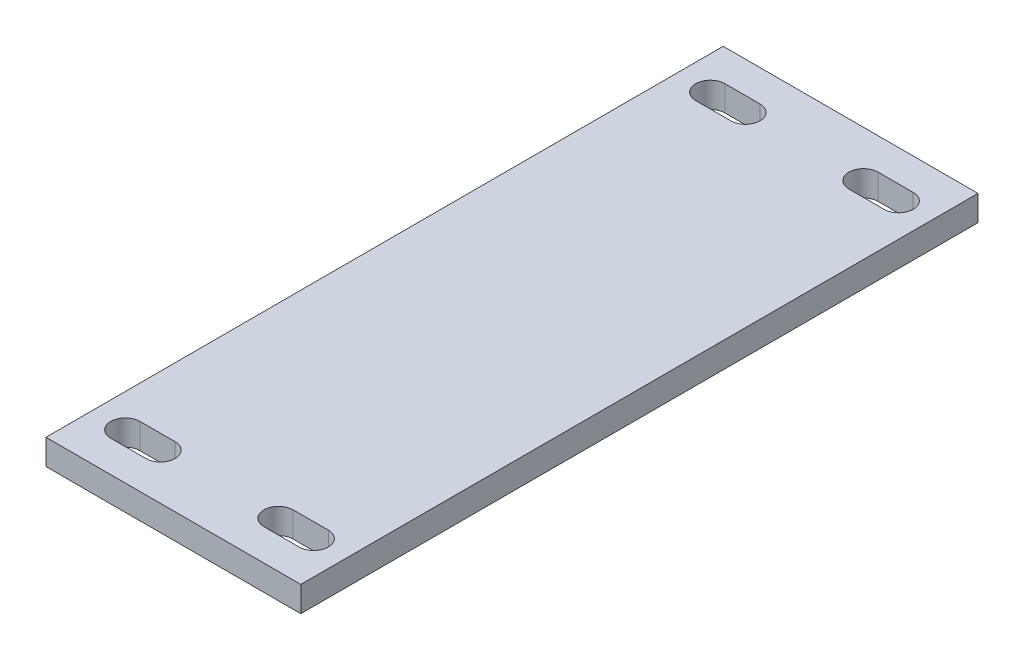
ISO-10303-21;
HEADER;
FILE_DESCRIPTION(('STEP AP214'),'2;1');
FILE_NAME('part.step','',(''),(''),'','','');
FILE_SCHEMA(('AUTOMOTIVE_DESIGN { 1 0 10303 214 1 1 1 1 }'));
ENDSEC;
DATA;
#1=APPLICATION_CONTEXT('core data for automotive mechanical design processes');
#2=APPLICATION_PROTOCOL_DEFINITION('international standard','automotive_design',2000,#1);
#3=PRODUCT_CONTEXT('',#1,'mechanical');
#4=PRODUCT('Part','Part','',(#3));
#5=PRODUCT_RELATED_PRODUCT_CATEGORY('part','',(#4));
#6=PRODUCT_DEFINITION_FORMATION('','',#4);
#7=PRODUCT_DEFINITION_CONTEXT('part definition',#1,'design');
#8=PRODUCT_DEFINITION('design','',#6,#7);
#9=PRODUCT_DEFINITION_SHAPE('','',#8);
#10=(LENGTH_UNIT() NAMED_UNIT(*) SI_UNIT(.MILLI.,.METRE.));
#11=(NAMED_UNIT(*) PLANE_ANGLE_UNIT() SI_UNIT($,.RADIAN.));
#12=(NAMED_UNIT(*) SI_UNIT($,.STERADIAN.) SOLID_ANGLE_UNIT());
#13=UNCERTAINTY_MEASURE_WITH_UNIT(LENGTH_MEASURE(1.E-05),#10,'distance_accuracy_value','');
#14=(GEOMETRIC_REPRESENTATION_CONTEXT(3) GLOBAL_UNCERTAINTY_ASSIGNED_CONTEXT((#13)) GLOBAL_UNIT_ASSIGNED_CONTEXT((#10,
#11,#12)) REPRESENTATION_CONTEXT('',''));
#15=CARTESIAN_POINT('',(0.,0.,0.));
#16=DIRECTION('',(0.,0.,1.));
#17=DIRECTION('',(1.,0.,0.));
#18=AXIS2_PLACEMENT_3D('',#15,#16,#17);
#19=CARTESIAN_POINT('',(0.,6.,0.));
#20=DIRECTION('',(0.,-1.,0.));
#21=DIRECTION('',(0.,0.,-1.));
#22=AXIS2_PLACEMENT_3D('',#19,#20,#21);
#23=PLANE('',#22);
#24=CARTESIAN_POINT('',(52.35,6.,-10.9));
#25=DIRECTION('',(0.,1.,0.));
#26=DIRECTION('',(0.,0.,1.));
#27=AXIS2_PLACEMENT_3D('',#24,#25,#26);
#28=CIRCLE('',#27,3.44999999999999);
#29=CARTESIAN_POINT('',(52.35,6.,-7.45000000000001));
#30=VERTEX_POINT('',#29);
#31=CARTESIAN_POINT('',(52.35,6.,-14.35));
#32=VERTEX_POINT('',#31);
#33=EDGE_CURVE('E210',#30,#32,#28,.T.);
#34=ORIENTED_EDGE('',*,*,#33,.F.);
#35=DIRECTION('',(1.,0.,0.));
#36=VECTOR('',#35,1.);
#37=CARTESIAN_POINT('',(52.35,6.,-7.45000000000001));
#38=LINE('',#37,#36);
#39=CARTESIAN_POINT('',(44.05,6.,-7.45000000000001));
#40=VERTEX_POINT('',#39);
#41=EDGE_CURVE('E218',#40,#30,#38,.T.);
#42=ORIENTED_EDGE('',*,*,#41,.F.);
#43=CARTESIAN_POINT('',(44.05,6.,-10.9));
#44=DIRECTION('',(0.,1.,0.));
#45=DIRECTION('',(0.,0.,1.));
#46=AXIS2_PLACEMENT_3D('',#43,#44,#45);
#47=CIRCLE('',#46,3.44999999999999);
#48=CARTESIAN_POINT('',(44.05,6.,-14.35));
#49=VERTEX_POINT('',#48);
#50=EDGE_CURVE('E215',#49,#40,#47,.T.);
#51=ORIENTED_EDGE('',*,*,#50,.F.);
#52=DIRECTION('',(-1.,0.,0.));
#53=VECTOR('',#52,1.);
#54=CARTESIAN_POINT('',(52.35,6.,-14.35));
#55=LINE('',#54,#53);
#56=EDGE_CURVE('E212',#32,#49,#55,.T.);
#57=ORIENTED_EDGE('',*,*,#56,.F.);
#58=EDGE_LOOP('',(#34,#42,#51,#57));
#59=FACE_BOUND('',#58,.T.);
#60=CARTESIAN_POINT('',(7.85,6.,-149.1));
#61=DIRECTION('',(0.,1.,0.));
#62=DIRECTION('',(0.,0.,1.));
#63=AXIS2_PLACEMENT_3D('',#60,#61,#62);
#64=CIRCLE('',#63,3.44999999999999);
#65=CARTESIAN_POINT('',(7.85,6.,-152.55));
#66=VERTEX_POINT('',#65);
#67=CARTESIAN_POINT('',(7.85,6.,-145.65));
#68=VERTEX_POINT('',#67);
#69=EDGE_CURVE('E272',#66,#68,#64,.T.);
#70=ORIENTED_EDGE('',*,*,#69,.F.);
#71=DIRECTION('',(-1.,0.,0.));
#72=VECTOR('',#71,1.);
#73=CARTESIAN_POINT('',(7.85,6.,-152.55));
#74=LINE('',#73,#72);
#75=CARTESIAN_POINT('',(16.15,6.,-152.55));
#76=VERTEX_POINT('',#75);
#77=EDGE_CURVE('E280',#76,#66,#74,.T.);
#78=ORIENTED_EDGE('',*,*,#77,.F.);
#79=CARTESIAN_POINT('',(16.15,6.,-149.1));
#80=DIRECTION('',(0.,1.,0.));
#81=DIRECTION('',(0.,0.,1.));
#82=AXIS2_PLACEMENT_3D('',#79,#80,#81);
#83=CIRCLE('',#82,3.44999999999999);
#84=CARTESIAN_POINT('',(16.15,6.,-145.65));
#85=VERTEX_POINT('',#84);
#86=EDGE_CURVE('E277',#85,#76,#83,.T.);
#87=ORIENTED_EDGE('',*,*,#86,.F.);
#88=DIRECTION('',(1.,0.,0.));
#89=VECTOR('',#88,1.);
#90=CARTESIAN_POINT('',(7.85,6.,-145.65));
#91=LINE('',#90,#89);
#92=EDGE_CURVE('E274',#68,#85,#91,.T.);
#93=ORIENTED_EDGE('',*,*,#92,.F.);
#94=EDGE_LOOP('',(#70,#78,#87,#93));
#95=FACE_BOUND('',#94,.T.);
#96=DIRECTION('',(0.,0.,1.));
#97=VECTOR('',#96,1.);
#98=CARTESIAN_POINT('',(0.,6.,0.));
#99=LINE('',#98,#97);
#100=CARTESIAN_POINT('',(0.,6.,-160.));
#101=VERTEX_POINT('',#100);
#102=CARTESIAN_POINT('',(0.,6.,0.));
#103=VERTEX_POINT('',#102);
#104=EDGE_CURVE('E303',#101,#103,#99,.T.);
#105=ORIENTED_EDGE('',*,*,#104,.T.);
#106=DIRECTION('',(1.,0.,0.));
#107=VECTOR('',#106,1.);
#108=CARTESIAN_POINT('',(0.,6.,0.));
#109=LINE('',#108,#107);
#110=CARTESIAN_POINT('',(60.2,6.,0.));
#111=VERTEX_POINT('',#110);
#112=EDGE_CURVE('E306',#103,#111,#109,.T.);
#113=ORIENTED_EDGE('',*,*,#112,.T.);
#114=DIRECTION('',(0.,0.,-1.));
#115=VECTOR('',#114,1.);
#116=CARTESIAN_POINT('',(60.2,6.,0.));
#117=LINE('',#116,#115);
#118=CARTESIAN_POINT('',(60.2,6.,-160.));
#119=VERTEX_POINT('',#118);
#120=EDGE_CURVE('E309',#111,#119,#117,.T.);
#121=ORIENTED_EDGE('',*,*,#120,.T.);
#122=DIRECTION('',(-1.,0.,0.));
#123=VECTOR('',#122,1.);
#124=CARTESIAN_POINT('',(0.,6.,-160.));
#125=LINE('',#124,#123);
#126=EDGE_CURVE('E311',#119,#101,#125,.T.);
#127=ORIENTED_EDGE('',*,*,#126,.T.);
#128=EDGE_LOOP('',(#105,#113,#121,#127));
#129=FACE_BOUND('',#128,.T.);
#130=CARTESIAN_POINT('',(52.35,6.,-149.1));
#131=DIRECTION('',(0.,1.,0.));
#132=DIRECTION('',(0.,0.,-1.));
#133=AXIS2_PLACEMENT_3D('',#130,#131,#132);
#134=CIRCLE('',#133,3.44999999999999);
#135=CARTESIAN_POINT('',(52.35,6.,-145.65));
#136=VERTEX_POINT('',#135);
#137=CARTESIAN_POINT('',(52.35,6.,-152.55));
#138=VERTEX_POINT('',#137);
#139=EDGE_CURVE('E241',#136,#138,#134,.T.);
#140=ORIENTED_EDGE('',*,*,#139,.F.);
#141=DIRECTION('',(1.,0.,0.));
#142=VECTOR('',#141,1.);
#143=CARTESIAN_POINT('',(52.35,6.,-145.65));
#144=LINE('',#143,#142);
#145=CARTESIAN_POINT('',(44.05,6.,-145.65));
#146=VERTEX_POINT('',#145);
#147=EDGE_CURVE('E249',#146,#136,#144,.T.);
#148=ORIENTED_EDGE('',*,*,#147,.F.);
#149=CARTESIAN_POINT('',(44.05,6.,-149.1));
#150=DIRECTION('',(0.,1.,0.));
#151=DIRECTION('',(0.,0.,-1.));
#152=AXIS2_PLACEMENT_3D('',#149,#150,#151);
#153=CIRCLE('',#152,3.44999999999999);
#154=CARTESIAN_POINT('',(44.05,6.,-152.55));
#155=VERTEX_POINT('',#154);
#156=EDGE_CURVE('E246',#155,#146,#153,.T.);
#157=ORIENTED_EDGE('',*,*,#156,.F.);
#158=DIRECTION('',(-1.,0.,0.));
#159=VECTOR('',#158,1.);
#160=CARTESIAN_POINT('',(52.35,6.,-152.55));
#161=LINE('',#160,#159);
#162=EDGE_CURVE('E243',#138,#155,#161,.T.);
#163=ORIENTED_EDGE('',*,*,#162,.F.);
#164=EDGE_LOOP('',(#140,#148,#157,#163));
#165=FACE_BOUND('',#164,.T.);
#166=CARTESIAN_POINT('',(7.85,6.,-10.9));
#167=DIRECTION('',(0.,1.,0.));
#168=DIRECTION('',(0.,0.,-1.));
#169=AXIS2_PLACEMENT_3D('',#166,#167,#168);
#170=CIRCLE('',#169,3.44999999999999);
#171=CARTESIAN_POINT('',(7.85,6.,-14.35));
#172=VERTEX_POINT('',#171);
#173=CARTESIAN_POINT('',(7.85,6.,-7.45000000000001));
#174=VERTEX_POINT('',#173);
#175=EDGE_CURVE('E174',#172,#174,#170,.T.);
#176=ORIENTED_EDGE('',*,*,#175,.F.);
#177=DIRECTION('',(-1.,0.,0.));
#178=VECTOR('',#177,1.);
#179=CARTESIAN_POINT('',(7.85,6.,-14.35));
#180=LINE('',#179,#178);
#181=CARTESIAN_POINT('',(16.15,6.,-14.35));
#182=VERTEX_POINT('',#181);
#183=EDGE_CURVE('E196',#182,#172,#180,.T.);
#184=ORIENTED_EDGE('',*,*,#183,.F.);
#185=CARTESIAN_POINT('',(16.15,6.,-10.9));
#186=DIRECTION('',(0.,1.,0.));
#187=DIRECTION('',(0.,0.,-1.));
#188=AXIS2_PLACEMENT_3D('',#185,#186,#187);
#189=CIRCLE('',#188,3.44999999999999);
#190=CARTESIAN_POINT('',(16.15,6.,-7.45000000000001));
#191=VERTEX_POINT('',#190);
#192=EDGE_CURVE('E194',#191,#182,#189,.T.);
#193=ORIENTED_EDGE('',*,*,#192,.F.);
#194=DIRECTION('',(1.,0.,0.));
#195=VECTOR('',#194,1.);
#196=CARTESIAN_POINT('',(7.85,6.,-7.45000000000001));
#197=LINE('',#196,#195);
#198=EDGE_CURVE('E182',#174,#191,#197,.T.);
#199=ORIENTED_EDGE('',*,*,#198,.F.);
#200=EDGE_LOOP('',(#176,#184,#193,#199));
#201=FACE_BOUND('',#200,.T.);
#202=ADVANCED_FACE('F37',(#59,#95,#129,#165,#201),#23,.F.);
#203=CARTESIAN_POINT('',(0.,0.,0.));
#204=DIRECTION('',(0.,-1.,0.));
#205=DIRECTION('',(0.,0.,-1.));
#206=AXIS2_PLACEMENT_3D('',#203,#204,#205);
#207=PLANE('',#206);
#208=DIRECTION('',(0.,0.,1.));
#209=VECTOR('',#208,1.);
#210=CARTESIAN_POINT('',(0.,0.,0.));
#211=LINE('',#210,#209);
#212=CARTESIAN_POINT('',(0.,0.,-160.));
#213=VERTEX_POINT('',#212);
#214=CARTESIAN_POINT('',(0.,0.,0.));
#215=VERTEX_POINT('',#214);
#216=EDGE_CURVE('E302',#213,#215,#211,.T.);
#217=ORIENTED_EDGE('',*,*,#216,.F.);
#218=DIRECTION('',(-1.,0.,0.));
#219=VECTOR('',#218,1.);
#220=CARTESIAN_POINT('',(0.,0.,-160.));
#221=LINE('',#220,#219);
#222=CARTESIAN_POINT('',(60.2,0.,-160.));
#223=VERTEX_POINT('',#222);
#224=EDGE_CURVE('E307',#223,#213,#221,.T.);
#225=ORIENTED_EDGE('',*,*,#224,.F.);
#226=DIRECTION('',(0.,0.,-1.));
#227=VECTOR('',#226,1.);
#228=CARTESIAN_POINT('',(60.2,0.,0.));
#229=LINE('',#228,#227);
#230=CARTESIAN_POINT('',(60.2,0.,0.));
#231=VERTEX_POINT('',#230);
#232=EDGE_CURVE('E318',#231,#223,#229,.T.);
#233=ORIENTED_EDGE('',*,*,#232,.F.);
#234=DIRECTION('',(1.,0.,0.));
#235=VECTOR('',#234,1.);
#236=CARTESIAN_POINT('',(0.,0.,0.));
#237=LINE('',#236,#235);
#238=EDGE_CURVE('E316',#215,#231,#237,.T.);
#239=ORIENTED_EDGE('',*,*,#238,.F.);
#240=EDGE_LOOP('',(#217,#225,#233,#239));
#241=FACE_BOUND('',#240,.T.);
#242=DIRECTION('',(-1.,0.,0.));
#243=VECTOR('',#242,1.);
#244=CARTESIAN_POINT('',(7.85,0.,-152.55));
#245=LINE('',#244,#243);
#246=CARTESIAN_POINT('',(16.15,0.,-152.55));
#247=VERTEX_POINT('',#246);
#248=CARTESIAN_POINT('',(7.85,0.,-152.55));
#249=VERTEX_POINT('',#248);
#250=EDGE_CURVE('E275',#247,#249,#245,.T.);
#251=ORIENTED_EDGE('',*,*,#250,.T.);
#252=CARTESIAN_POINT('',(7.85,0.,-149.1));
#253=DIRECTION('',(0.,1.,0.));
#254=DIRECTION('',(0.,0.,1.));
#255=AXIS2_PLACEMENT_3D('',#252,#253,#254);
#256=CIRCLE('',#255,3.44999999999999);
#257=CARTESIAN_POINT('',(7.85,0.,-145.65));
#258=VERTEX_POINT('',#257);
#259=EDGE_CURVE('E271',#249,#258,#256,.T.);
#260=ORIENTED_EDGE('',*,*,#259,.T.);
#261=DIRECTION('',(1.,0.,0.));
#262=VECTOR('',#261,1.);
#263=CARTESIAN_POINT('',(7.85,0.,-145.65));
#264=LINE('',#263,#262);
#265=CARTESIAN_POINT('',(16.15,0.,-145.65));
#266=VERTEX_POINT('',#265);
#267=EDGE_CURVE('E285',#258,#266,#264,.T.);
#268=ORIENTED_EDGE('',*,*,#267,.T.);
#269=CARTESIAN_POINT('',(16.15,0.,-149.1));
#270=DIRECTION('',(0.,1.,0.));
#271=DIRECTION('',(0.,0.,1.));
#272=AXIS2_PLACEMENT_3D('',#269,#270,#271);
#273=CIRCLE('',#272,3.44999999999999);
#274=EDGE_CURVE('E288',#266,#247,#273,.T.);
#275=ORIENTED_EDGE('',*,*,#274,.T.);
#276=EDGE_LOOP('',(#251,#260,#268,#275));
#277=FACE_BOUND('',#276,.T.);
#278=DIRECTION('',(1.,0.,0.));
#279=VECTOR('',#278,1.);
#280=CARTESIAN_POINT('',(52.35,0.,-145.65));
#281=LINE('',#280,#279);
#282=CARTESIAN_POINT('',(44.05,0.,-145.65));
#283=VERTEX_POINT('',#282);
#284=CARTESIAN_POINT('',(52.35,0.,-145.65));
#285=VERTEX_POINT('',#284);
#286=EDGE_CURVE('E244',#283,#285,#281,.T.);
#287=ORIENTED_EDGE('',*,*,#286,.T.);
#288=CARTESIAN_POINT('',(52.35,0.,-149.1));
#289=DIRECTION('',(0.,1.,0.));
#290=DIRECTION('',(0.,0.,-1.));
#291=AXIS2_PLACEMENT_3D('',#288,#289,#290);
#292=CIRCLE('',#291,3.44999999999999);
#293=CARTESIAN_POINT('',(52.35,0.,-152.55));
#294=VERTEX_POINT('',#293);
#295=EDGE_CURVE('E240',#285,#294,#292,.T.);
#296=ORIENTED_EDGE('',*,*,#295,.T.);
#297=DIRECTION('',(-1.,0.,0.));
#298=VECTOR('',#297,1.);
#299=CARTESIAN_POINT('',(52.35,0.,-152.55));
#300=LINE('',#299,#298);
#301=CARTESIAN_POINT('',(44.05,0.,-152.55));
#302=VERTEX_POINT('',#301);
#303=EDGE_CURVE('E254',#294,#302,#300,.T.);
#304=ORIENTED_EDGE('',*,*,#303,.T.);
#305=CARTESIAN_POINT('',(44.05,0.,-149.1));
#306=DIRECTION('',(0.,1.,0.));
#307=DIRECTION('',(0.,0.,-1.));
#308=AXIS2_PLACEMENT_3D('',#305,#306,#307);
#309=CIRCLE('',#308,3.44999999999999);
#310=EDGE_CURVE('E257',#302,#283,#309,.T.);
#311=ORIENTED_EDGE('',*,*,#310,.T.);
#312=EDGE_LOOP('',(#287,#296,#304,#311));
#313=FACE_BOUND('',#312,.T.);
#314=DIRECTION('',(1.,0.,0.));
#315=VECTOR('',#314,1.);
#316=CARTESIAN_POINT('',(52.35,0.,-7.45000000000001));
#317=LINE('',#316,#315);
#318=CARTESIAN_POINT('',(44.05,0.,-7.45000000000001));
#319=VERTEX_POINT('',#318);
#320=CARTESIAN_POINT('',(52.35,0.,-7.45000000000001));
#321=VERTEX_POINT('',#320);
#322=EDGE_CURVE('E213',#319,#321,#317,.T.);
#323=ORIENTED_EDGE('',*,*,#322,.T.);
#324=CARTESIAN_POINT('',(52.35,0.,-10.9));
#325=DIRECTION('',(0.,1.,0.));
#326=DIRECTION('',(0.,0.,1.));
#327=AXIS2_PLACEMENT_3D('',#324,#325,#326);
#328=CIRCLE('',#327,3.44999999999999);
#329=CARTESIAN_POINT('',(52.35,0.,-14.35));
#330=VERTEX_POINT('',#329);
#331=EDGE_CURVE('E190',#321,#330,#328,.T.);
#332=ORIENTED_EDGE('',*,*,#331,.T.);
#333=DIRECTION('',(-1.,0.,0.));
#334=VECTOR('',#333,1.);
#335=CARTESIAN_POINT('',(52.35,0.,-14.35));
#336=LINE('',#335,#334);
#337=CARTESIAN_POINT('',(44.05,0.,-14.35));
#338=VERTEX_POINT('',#337);
#339=EDGE_CURVE('E223',#330,#338,#336,.T.);
#340=ORIENTED_EDGE('',*,*,#339,.T.);
#341=CARTESIAN_POINT('',(44.05,0.,-10.9));
#342=DIRECTION('',(0.,1.,0.));
#343=DIRECTION('',(0.,0.,1.));
#344=AXIS2_PLACEMENT_3D('',#341,#342,#343);
#345=CIRCLE('',#344,3.44999999999999);
#346=EDGE_CURVE('E226',#338,#319,#345,.T.);
#347=ORIENTED_EDGE('',*,*,#346,.T.);
#348=EDGE_LOOP('',(#323,#332,#340,#347));
#349=FACE_BOUND('',#348,.T.);
#350=DIRECTION('',(-1.,0.,0.));
#351=VECTOR('',#350,1.);
#352=CARTESIAN_POINT('',(7.85,0.,-14.35));
#353=LINE('',#352,#351);
#354=CARTESIAN_POINT('',(16.15,0.,-14.35));
#355=VERTEX_POINT('',#354);
#356=CARTESIAN_POINT('',(7.85,0.,-14.35));
#357=VERTEX_POINT('',#356);
#358=EDGE_CURVE('E183',#355,#357,#353,.T.);
#359=ORIENTED_EDGE('',*,*,#358,.T.);
#360=CARTESIAN_POINT('',(7.85,0.,-10.9));
#361=DIRECTION('',(0.,1.,0.));
#362=DIRECTION('',(0.,0.,-1.));
#363=AXIS2_PLACEMENT_3D('',#360,#361,#362);
#364=CIRCLE('',#363,3.44999999999999);
#365=CARTESIAN_POINT('',(7.85,0.,-7.45000000000001));
#366=VERTEX_POINT('',#365);
#367=EDGE_CURVE('E60',#357,#366,#364,.T.);
#368=ORIENTED_EDGE('',*,*,#367,.T.);
#369=DIRECTION('',(1.,0.,0.));
#370=VECTOR('',#369,1.);
#371=CARTESIAN_POINT('',(7.85,0.,-7.45000000000001));
#372=LINE('',#371,#370);
#373=CARTESIAN_POINT('',(16.15,0.,-7.45000000000001));
#374=VERTEX_POINT('',#373);
#375=EDGE_CURVE('E189',#366,#374,#372,.T.);
#376=ORIENTED_EDGE('',*,*,#375,.T.);
#377=CARTESIAN_POINT('',(16.15,0.,-10.9));
#378=DIRECTION('',(0.,1.,0.));
#379=DIRECTION('',(0.,0.,-1.));
#380=AXIS2_PLACEMENT_3D('',#377,#378,#379);
#381=CIRCLE('',#380,3.44999999999999);
#382=EDGE_CURVE('E202',#374,#355,#381,.T.);
#383=ORIENTED_EDGE('',*,*,#382,.T.);
#384=EDGE_LOOP('',(#359,#368,#376,#383));
#385=FACE_BOUND('',#384,.T.);
#386=ADVANCED_FACE('F336',(#241,#277,#313,#349,#385),#207,.T.);
#387=CARTESIAN_POINT('',(0.,6.,0.));
#388=DIRECTION('',(1.,0.,0.));
#389=DIRECTION('',(0.,0.,-1.));
#390=AXIS2_PLACEMENT_3D('',#387,#388,#389);
#391=PLANE('',#390);
#392=ORIENTED_EDGE('',*,*,#216,.T.);
#393=DIRECTION('',(0.,-1.,0.));
#394=VECTOR('',#393,1.);
#395=CARTESIAN_POINT('',(0.,6.,0.));
#396=LINE('',#395,#394);
#397=EDGE_CURVE('E11',#103,#215,#396,.T.);
#398=ORIENTED_EDGE('',*,*,#397,.F.);
#399=ORIENTED_EDGE('',*,*,#104,.F.);
#400=DIRECTION('',(0.,-1.,0.));
#401=VECTOR('',#400,1.);
#402=CARTESIAN_POINT('',(0.,6.,-160.));
#403=LINE('',#402,#401);
#404=EDGE_CURVE('E313',#101,#213,#403,.T.);
#405=ORIENTED_EDGE('',*,*,#404,.T.);
#406=EDGE_LOOP('',(#392,#398,#399,#405));
#407=FACE_BOUND('',#406,.T.);
#408=ADVANCED_FACE('F39',(#407),#391,.F.);
#409=CARTESIAN_POINT('',(0.,6.,0.));
#410=DIRECTION('',(0.,0.,-1.));
#411=DIRECTION('',(-1.,0.,0.));
#412=AXIS2_PLACEMENT_3D('',#409,#410,#411);
#413=PLANE('',#412);
#414=ORIENTED_EDGE('',*,*,#238,.T.);
#415=DIRECTION('',(0.,-1.,0.));
#416=VECTOR('',#415,1.);
#417=CARTESIAN_POINT('',(60.2,6.,0.));
#418=LINE('',#417,#416);
#419=EDGE_CURVE('E45',#111,#231,#418,.T.);
#420=ORIENTED_EDGE('',*,*,#419,.F.);
#421=ORIENTED_EDGE('',*,*,#112,.F.);
#422=ORIENTED_EDGE('',*,*,#397,.T.);
#423=EDGE_LOOP('',(#414,#420,#421,#422));
#424=FACE_BOUND('',#423,.T.);
#425=ADVANCED_FACE('F347',(#424),#413,.F.);
#426=CARTESIAN_POINT('',(60.2,6.,0.));
#427=DIRECTION('',(-1.,0.,0.));
#428=DIRECTION('',(0.,0.,1.));
#429=AXIS2_PLACEMENT_3D('',#426,#427,#428);
#430=PLANE('',#429);
#431=ORIENTED_EDGE('',*,*,#232,.T.);
#432=DIRECTION('',(0.,-1.,0.));
#433=VECTOR('',#432,1.);
#434=CARTESIAN_POINT('',(60.2,6.,-160.));
#435=LINE('',#434,#433);
#436=EDGE_CURVE('E323',#119,#223,#435,.T.);
#437=ORIENTED_EDGE('',*,*,#436,.F.);
#438=ORIENTED_EDGE('',*,*,#120,.F.);
#439=ORIENTED_EDGE('',*,*,#419,.T.);
#440=EDGE_LOOP('',(#431,#437,#438,#439));
#441=FACE_BOUND('',#440,.T.);
#442=ADVANCED_FACE('F330',(#441),#430,.F.);
#443=CARTESIAN_POINT('',(0.,6.,-160.));
#444=DIRECTION('',(0.,0.,1.));
#445=DIRECTION('',(1.,0.,0.));
#446=AXIS2_PLACEMENT_3D('',#443,#444,#445);
#447=PLANE('',#446);
#448=ORIENTED_EDGE('',*,*,#224,.T.);
#449=ORIENTED_EDGE('',*,*,#404,.F.);
#450=ORIENTED_EDGE('',*,*,#126,.F.);
#451=ORIENTED_EDGE('',*,*,#436,.T.);
#452=EDGE_LOOP('',(#448,#449,#450,#451));
#453=FACE_BOUND('',#452,.T.);
#454=ADVANCED_FACE('F340',(#453),#447,.F.);
#455=CARTESIAN_POINT('',(7.85,6.,-149.1));
#456=DIRECTION('',(0.,-1.,0.));
#457=DIRECTION('',(0.,0.,-1.));
#458=AXIS2_PLACEMENT_3D('',#455,#456,#457);
#459=CYLINDRICAL_SURFACE('',#458,3.44999999999999);
#460=ORIENTED_EDGE('',*,*,#259,.F.);
#461=DIRECTION('',(0.,-1.,0.));
#462=VECTOR('',#461,1.);
#463=CARTESIAN_POINT('',(7.85,6.,-152.55));
#464=LINE('',#463,#462);
#465=EDGE_CURVE('E282',#66,#249,#464,.T.);
#466=ORIENTED_EDGE('',*,*,#465,.F.);
#467=ORIENTED_EDGE('',*,*,#69,.T.);
#468=DIRECTION('',(0.,-1.,0.));
#469=VECTOR('',#468,1.);
#470=CARTESIAN_POINT('',(7.85,6.,-145.65));
#471=LINE('',#470,#469);
#472=EDGE_CURVE('E299',#68,#258,#471,.T.);
#473=ORIENTED_EDGE('',*,*,#472,.T.);
#474=EDGE_LOOP('',(#460,#466,#467,#473));
#475=FACE_BOUND('',#474,.T.);
#476=ADVANCED_FACE('F364',(#475),#459,.F.);
#477=CARTESIAN_POINT('',(7.85,6.,-145.65));
#478=DIRECTION('',(0.,0.,-1.));
#479=DIRECTION('',(-1.,0.,0.));
#480=AXIS2_PLACEMENT_3D('',#477,#478,#479);
#481=PLANE('',#480);
#482=ORIENTED_EDGE('',*,*,#267,.F.);
#483=ORIENTED_EDGE('',*,*,#472,.F.);
#484=ORIENTED_EDGE('',*,*,#92,.T.);
#485=DIRECTION('',(0.,-1.,0.));
#486=VECTOR('',#485,1.);
#487=CARTESIAN_POINT('',(16.15,6.,-145.65));
#488=LINE('',#487,#486);
#489=EDGE_CURVE('E297',#85,#266,#488,.T.);
#490=ORIENTED_EDGE('',*,*,#489,.T.);
#491=EDGE_LOOP('',(#482,#483,#484,#490));
#492=FACE_BOUND('',#491,.T.);
#493=ADVANCED_FACE('F371',(#492),#481,.T.);
#494=CARTESIAN_POINT('',(16.15,6.,-149.1));
#495=DIRECTION('',(0.,-1.,0.));
#496=DIRECTION('',(0.,0.,-1.));
#497=AXIS2_PLACEMENT_3D('',#494,#495,#496);
#498=CYLINDRICAL_SURFACE('',#497,3.44999999999999);
#499=ORIENTED_EDGE('',*,*,#274,.F.);
#500=ORIENTED_EDGE('',*,*,#489,.F.);
#501=ORIENTED_EDGE('',*,*,#86,.T.);
#502=DIRECTION('',(0.,-1.,0.));
#503=VECTOR('',#502,1.);
#504=CARTESIAN_POINT('',(16.15,6.,-152.55));
#505=LINE('',#504,#503);
#506=EDGE_CURVE('E295',#76,#247,#505,.T.);
#507=ORIENTED_EDGE('',*,*,#506,.T.);
#508=EDGE_LOOP('',(#499,#500,#501,#507));
#509=FACE_BOUND('',#508,.T.);
#510=ADVANCED_FACE('F376',(#509),#498,.F.);
#511=CARTESIAN_POINT('',(7.85,6.,-152.55));
#512=DIRECTION('',(0.,0.,1.));
#513=DIRECTION('',(1.,0.,0.));
#514=AXIS2_PLACEMENT_3D('',#511,#512,#513);
#515=PLANE('',#514);
#516=ORIENTED_EDGE('',*,*,#250,.F.);
#517=ORIENTED_EDGE('',*,*,#506,.F.);
#518=ORIENTED_EDGE('',*,*,#77,.T.);
#519=ORIENTED_EDGE('',*,*,#465,.T.);
#520=EDGE_LOOP('',(#516,#517,#518,#519));
#521=FACE_BOUND('',#520,.T.);
#522=ADVANCED_FACE('F383',(#521),#515,.T.);
#523=CARTESIAN_POINT('',(52.35,6.,-149.1));
#524=DIRECTION('',(0.,-1.,0.));
#525=DIRECTION('',(0.,0.,-1.));
#526=AXIS2_PLACEMENT_3D('',#523,#524,#525);
#527=CYLINDRICAL_SURFACE('',#526,3.44999999999999);
#528=ORIENTED_EDGE('',*,*,#295,.F.);
#529=DIRECTION('',(0.,-1.,0.));
#530=VECTOR('',#529,1.);
#531=CARTESIAN_POINT('',(52.35,6.,-145.65));
#532=LINE('',#531,#530);
#533=EDGE_CURVE('E251',#136,#285,#532,.T.);
#534=ORIENTED_EDGE('',*,*,#533,.F.);
#535=ORIENTED_EDGE('',*,*,#139,.T.);
#536=DIRECTION('',(0.,-1.,0.));
#537=VECTOR('',#536,1.);
#538=CARTESIAN_POINT('',(52.35,6.,-152.55));
#539=LINE('',#538,#537);
#540=EDGE_CURVE('E268',#138,#294,#539,.T.);
#541=ORIENTED_EDGE('',*,*,#540,.T.);
#542=EDGE_LOOP('',(#528,#534,#535,#541));
#543=FACE_BOUND('',#542,.T.);
#544=ADVANCED_FACE('F396',(#543),#527,.F.);
#545=CARTESIAN_POINT('',(52.35,6.,-152.55));
#546=DIRECTION('',(0.,0.,1.));
#547=DIRECTION('',(1.,0.,0.));
#548=AXIS2_PLACEMENT_3D('',#545,#546,#547);
#549=PLANE('',#548);
#550=ORIENTED_EDGE('',*,*,#303,.F.);
#551=ORIENTED_EDGE('',*,*,#540,.F.);
#552=ORIENTED_EDGE('',*,*,#162,.T.);
#553=DIRECTION('',(0.,-1.,0.));
#554=VECTOR('',#553,1.);
#555=CARTESIAN_POINT('',(44.05,6.,-152.55));
#556=LINE('',#555,#554);
#557=EDGE_CURVE('E266',#155,#302,#556,.T.);
#558=ORIENTED_EDGE('',*,*,#557,.T.);
#559=EDGE_LOOP('',(#550,#551,#552,#558));
#560=FACE_BOUND('',#559,.T.);
#561=ADVANCED_FACE('F401',(#560),#549,.T.);
#562=CARTESIAN_POINT('',(44.05,6.,-149.1));
#563=DIRECTION('',(0.,-1.,0.));
#564=DIRECTION('',(0.,0.,-1.));
#565=AXIS2_PLACEMENT_3D('',#562,#563,#564);
#566=CYLINDRICAL_SURFACE('',#565,3.44999999999999);
#567=ORIENTED_EDGE('',*,*,#310,.F.);
#568=ORIENTED_EDGE('',*,*,#557,.F.);
#569=ORIENTED_EDGE('',*,*,#156,.T.);
#570=DIRECTION('',(0.,-1.,0.));
#571=VECTOR('',#570,1.);
#572=CARTESIAN_POINT('',(44.05,6.,-145.65));
#573=LINE('',#572,#571);
#574=EDGE_CURVE('E264',#146,#283,#573,.T.);
#575=ORIENTED_EDGE('',*,*,#574,.T.);
#576=EDGE_LOOP('',(#567,#568,#569,#575));
#577=FACE_BOUND('',#576,.T.);
#578=ADVANCED_FACE('F405',(#577),#566,.F.);
#579=CARTESIAN_POINT('',(52.35,6.,-145.65));
#580=DIRECTION('',(0.,0.,-1.));
#581=DIRECTION('',(-1.,0.,0.));
#582=AXIS2_PLACEMENT_3D('',#579,#580,#581);
#583=PLANE('',#582);
#584=ORIENTED_EDGE('',*,*,#286,.F.);
#585=ORIENTED_EDGE('',*,*,#574,.F.);
#586=ORIENTED_EDGE('',*,*,#147,.T.);
#587=ORIENTED_EDGE('',*,*,#533,.T.);
#588=EDGE_LOOP('',(#584,#585,#586,#587));
#589=FACE_BOUND('',#588,.T.);
#590=ADVANCED_FACE('F409',(#589),#583,.T.);
#591=CARTESIAN_POINT('',(52.35,6.,-10.9));
#592=DIRECTION('',(0.,-1.,0.));
#593=DIRECTION('',(0.,0.,-1.));
#594=AXIS2_PLACEMENT_3D('',#591,#592,#593);
#595=CYLINDRICAL_SURFACE('',#594,3.44999999999999);
#596=ORIENTED_EDGE('',*,*,#331,.F.);
#597=DIRECTION('',(0.,-1.,0.));
#598=VECTOR('',#597,1.);
#599=CARTESIAN_POINT('',(52.35,6.,-7.45000000000001));
#600=LINE('',#599,#598);
#601=EDGE_CURVE('E220',#30,#321,#600,.T.);
#602=ORIENTED_EDGE('',*,*,#601,.F.);
#603=ORIENTED_EDGE('',*,*,#33,.T.);
#604=DIRECTION('',(0.,-1.,0.));
#605=VECTOR('',#604,1.);
#606=CARTESIAN_POINT('',(52.35,6.,-14.35));
#607=LINE('',#606,#605);
#608=EDGE_CURVE('E237',#32,#330,#607,.T.);
#609=ORIENTED_EDGE('',*,*,#608,.T.);
#610=EDGE_LOOP('',(#596,#602,#603,#609));
#611=FACE_BOUND('',#610,.T.);
#612=ADVANCED_FACE('F413',(#611),#595,.F.);
#613=CARTESIAN_POINT('',(52.35,6.,-14.35));
#614=DIRECTION('',(0.,0.,1.));
#615=DIRECTION('',(1.,0.,0.));
#616=AXIS2_PLACEMENT_3D('',#613,#614,#615);
#617=PLANE('',#616);
#618=ORIENTED_EDGE('',*,*,#339,.F.);
#619=ORIENTED_EDGE('',*,*,#608,.F.);
#620=ORIENTED_EDGE('',*,*,#56,.T.);
#621=DIRECTION('',(0.,-1.,0.));
#622=VECTOR('',#621,1.);
#623=CARTESIAN_POINT('',(44.05,6.,-14.35));
#624=LINE('',#623,#622);
#625=EDGE_CURVE('E235',#49,#338,#624,.T.);
#626=ORIENTED_EDGE('',*,*,#625,.T.);
#627=EDGE_LOOP('',(#618,#619,#620,#626));
#628=FACE_BOUND('',#627,.T.);
#629=ADVANCED_FACE('F417',(#628),#617,.T.);
#630=CARTESIAN_POINT('',(44.05,6.,-10.9));
#631=DIRECTION('',(0.,-1.,0.));
#632=DIRECTION('',(0.,0.,-1.));
#633=AXIS2_PLACEMENT_3D('',#630,#631,#632);
#634=CYLINDRICAL_SURFACE('',#633,3.44999999999999);
#635=ORIENTED_EDGE('',*,*,#346,.F.);
#636=ORIENTED_EDGE('',*,*,#625,.F.);
#637=ORIENTED_EDGE('',*,*,#50,.T.);
#638=DIRECTION('',(0.,-1.,0.));
#639=VECTOR('',#638,1.);
#640=CARTESIAN_POINT('',(44.05,6.,-7.45000000000001));
#641=LINE('',#640,#639);
#642=EDGE_CURVE('E233',#40,#319,#641,.T.);
#643=ORIENTED_EDGE('',*,*,#642,.T.);
#644=EDGE_LOOP('',(#635,#636,#637,#643));
#645=FACE_BOUND('',#644,.T.);
#646=ADVANCED_FACE('F421',(#645),#634,.F.);
#647=CARTESIAN_POINT('',(52.35,6.,-7.45000000000001));
#648=DIRECTION('',(0.,0.,-1.));
#649=DIRECTION('',(-1.,0.,0.));
#650=AXIS2_PLACEMENT_3D('',#647,#648,#649);
#651=PLANE('',#650);
#652=ORIENTED_EDGE('',*,*,#322,.F.);
#653=ORIENTED_EDGE('',*,*,#642,.F.);
#654=ORIENTED_EDGE('',*,*,#41,.T.);
#655=ORIENTED_EDGE('',*,*,#601,.T.);
#656=EDGE_LOOP('',(#652,#653,#654,#655));
#657=FACE_BOUND('',#656,.T.);
#658=ADVANCED_FACE('F425',(#657),#651,.T.);
#659=CARTESIAN_POINT('',(7.85,6.,-10.9));
#660=DIRECTION('',(0.,-1.,0.));
#661=DIRECTION('',(0.,0.,-1.));
#662=AXIS2_PLACEMENT_3D('',#659,#660,#661);
#663=CYLINDRICAL_SURFACE('',#662,3.44999999999999);
#664=ORIENTED_EDGE('',*,*,#367,.F.);
#665=DIRECTION('',(0.,-1.,0.));
#666=VECTOR('',#665,1.);
#667=CARTESIAN_POINT('',(7.85,6.,-14.35));
#668=LINE('',#667,#666);
#669=EDGE_CURVE('E178',#172,#357,#668,.T.);
#670=ORIENTED_EDGE('',*,*,#669,.F.);
#671=ORIENTED_EDGE('',*,*,#175,.T.);
#672=DIRECTION('',(0.,-1.,0.));
#673=VECTOR('',#672,1.);
#674=CARTESIAN_POINT('',(7.85,6.,-7.45000000000001));
#675=LINE('',#674,#673);
#676=EDGE_CURVE('E177',#174,#366,#675,.T.);
#677=ORIENTED_EDGE('',*,*,#676,.T.);
#678=EDGE_LOOP('',(#664,#670,#671,#677));
#679=FACE_BOUND('',#678,.T.);
#680=ADVANCED_FACE('F176',(#679),#663,.F.);
#681=CARTESIAN_POINT('',(7.85,6.,-7.45000000000001));
#682=DIRECTION('',(0.,0.,-1.));
#683=DIRECTION('',(-1.,0.,0.));
#684=AXIS2_PLACEMENT_3D('',#681,#682,#683);
#685=PLANE('',#684);
#686=ORIENTED_EDGE('',*,*,#375,.F.);
#687=ORIENTED_EDGE('',*,*,#676,.F.);
#688=ORIENTED_EDGE('',*,*,#198,.T.);
#689=DIRECTION('',(0.,-1.,0.));
#690=VECTOR('',#689,1.);
#691=CARTESIAN_POINT('',(16.15,6.,-7.45000000000001));
#692=LINE('',#691,#690);
#693=EDGE_CURVE('E191',#191,#374,#692,.T.);
#694=ORIENTED_EDGE('',*,*,#693,.T.);
#695=EDGE_LOOP('',(#686,#687,#688,#694));
#696=FACE_BOUND('',#695,.T.);
#697=ADVANCED_FACE('F186',(#696),#685,.T.);
#698=CARTESIAN_POINT('',(16.15,6.,-10.9));
#699=DIRECTION('',(0.,-1.,0.));
#700=DIRECTION('',(0.,0.,-1.));
#701=AXIS2_PLACEMENT_3D('',#698,#699,#700);
#702=CYLINDRICAL_SURFACE('',#701,3.44999999999999);
#703=ORIENTED_EDGE('',*,*,#382,.F.);
#704=ORIENTED_EDGE('',*,*,#693,.F.);
#705=ORIENTED_EDGE('',*,*,#192,.T.);
#706=DIRECTION('',(0.,-1.,0.));
#707=VECTOR('',#706,1.);
#708=CARTESIAN_POINT('',(16.15,6.,-14.35));
#709=LINE('',#708,#707);
#710=EDGE_CURVE('E52',#182,#355,#709,.T.);
#711=ORIENTED_EDGE('',*,*,#710,.T.);
#712=EDGE_LOOP('',(#703,#704,#705,#711));
#713=FACE_BOUND('',#712,.T.);
#714=ADVANCED_FACE('F434',(#713),#702,.F.);
#715=CARTESIAN_POINT('',(7.85,6.,-14.35));
#716=DIRECTION('',(0.,0.,1.));
#717=DIRECTION('',(1.,0.,0.));
#718=AXIS2_PLACEMENT_3D('',#715,#716,#717);
#719=PLANE('',#718);
#720=ORIENTED_EDGE('',*,*,#358,.F.);
#721=ORIENTED_EDGE('',*,*,#710,.F.);
#722=ORIENTED_EDGE('',*,*,#183,.T.);
#723=ORIENTED_EDGE('',*,*,#669,.T.);
#724=EDGE_LOOP('',(#720,#721,#722,#723));
#725=FACE_BOUND('',#724,.T.);
#726=ADVANCED_FACE('F437',(#725),#719,.T.);
#727=CLOSED_SHELL('',(#202,#386,#408,#425,#442,#454,#476,#493,#510,#522,#544,#561,#578,#590,
#612,#629,#646,#658,#680,#697,#714,#726));
#728=MANIFOLD_SOLID_BREP('B2',#727);
#729=ADVANCED_BREP_SHAPE_REPRESENTATION('',(#18,#728),#14);
#730=SHAPE_DEFINITION_REPRESENTATION(#9,#729);
ENDSEC;
END-ISO-10303-21;
